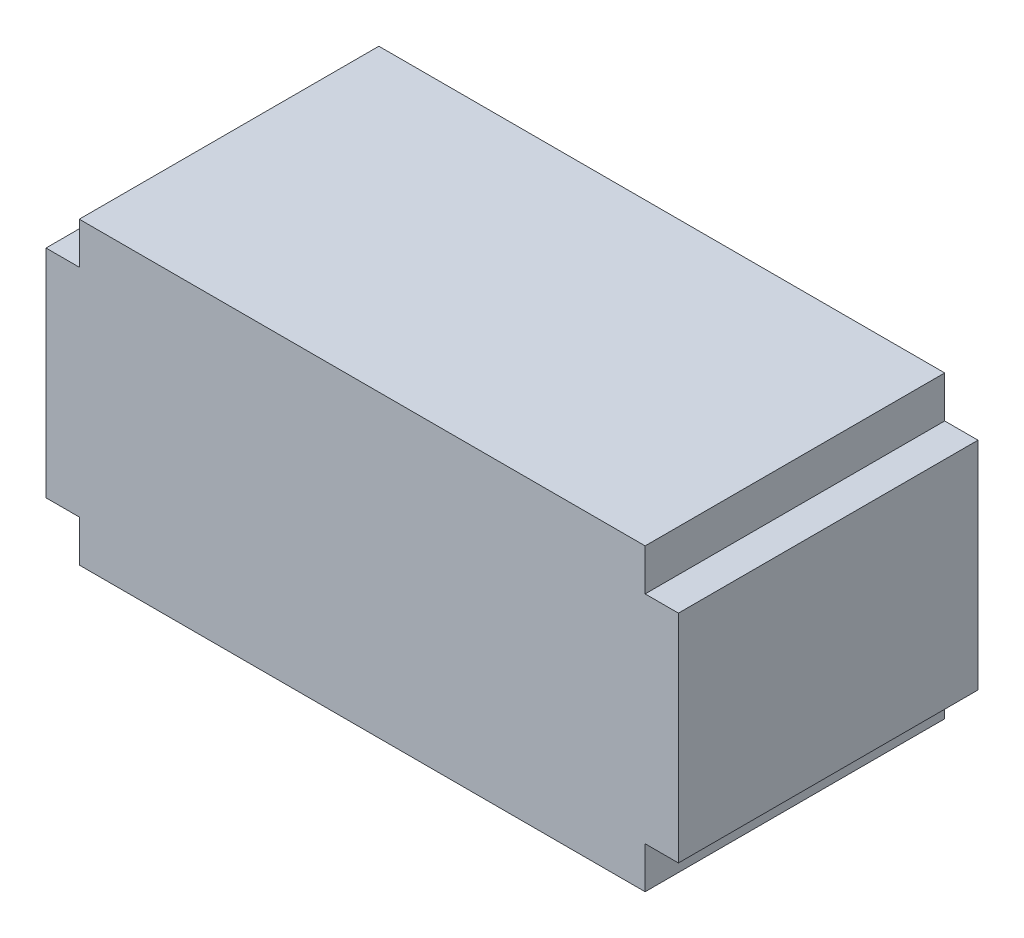
ISO-10303-21;
HEADER;
FILE_DESCRIPTION(('STEP AP214'),'2;1');
FILE_NAME('part.step','',(''),(''),'','','');
FILE_SCHEMA(('AUTOMOTIVE_DESIGN { 1 0 10303 214 1 1 1 1 }'));
ENDSEC;
DATA;
#1=APPLICATION_CONTEXT('core data for automotive mechanical design processes');
#2=APPLICATION_PROTOCOL_DEFINITION('international standard','automotive_design',2000,#1);
#3=PRODUCT_CONTEXT('',#1,'mechanical');
#4=PRODUCT('Part','Part','',(#3));
#5=PRODUCT_RELATED_PRODUCT_CATEGORY('part','',(#4));
#6=PRODUCT_DEFINITION_FORMATION('','',#4);
#7=PRODUCT_DEFINITION_CONTEXT('part definition',#1,'design');
#8=PRODUCT_DEFINITION('design','',#6,#7);
#9=PRODUCT_DEFINITION_SHAPE('','',#8);
#10=(LENGTH_UNIT() NAMED_UNIT(*) SI_UNIT(.MILLI.,.METRE.));
#11=(NAMED_UNIT(*) PLANE_ANGLE_UNIT() SI_UNIT($,.RADIAN.));
#12=(NAMED_UNIT(*) SI_UNIT($,.STERADIAN.) SOLID_ANGLE_UNIT());
#13=UNCERTAINTY_MEASURE_WITH_UNIT(LENGTH_MEASURE(1.E-05),#10,'distance_accuracy_value','');
#14=(GEOMETRIC_REPRESENTATION_CONTEXT(3) GLOBAL_UNCERTAINTY_ASSIGNED_CONTEXT((#13)) GLOBAL_UNIT_ASSIGNED_CONTEXT((#10,
#11,#12)) REPRESENTATION_CONTEXT('',''));
#15=CARTESIAN_POINT('',(0.,0.,0.));
#16=DIRECTION('',(0.,0.,1.));
#17=DIRECTION('',(1.,0.,0.));
#18=AXIS2_PLACEMENT_3D('',#15,#16,#17);
#19=CARTESIAN_POINT('',(1.7,-0.9,1.8));
#20=DIRECTION('',(0.,1.,0.));
#21=DIRECTION('',(0.,0.,1.));
#22=AXIS2_PLACEMENT_3D('',#19,#20,#21);
#23=PLANE('',#22);
#24=DIRECTION('',(1.,0.,0.));
#25=VECTOR('',#24,1.);
#26=CARTESIAN_POINT('',(1.7,-0.9,0.));
#27=LINE('',#26,#25);
#28=CARTESIAN_POINT('',(-1.7,-0.9,0.));
#29=VERTEX_POINT('',#28);
#30=CARTESIAN_POINT('',(1.7,-0.9,0.));
#31=VERTEX_POINT('',#30);
#32=EDGE_CURVE('E154',#29,#31,#27,.T.);
#33=ORIENTED_EDGE('',*,*,#32,.T.);
#34=DIRECTION('',(0.,0.,-1.));
#35=VECTOR('',#34,1.);
#36=CARTESIAN_POINT('',(1.7,-0.9,1.8));
#37=LINE('',#36,#35);
#38=CARTESIAN_POINT('',(1.7,-0.9,1.8));
#39=VERTEX_POINT('',#38);
#40=EDGE_CURVE('E11',#39,#31,#37,.T.);
#41=ORIENTED_EDGE('',*,*,#40,.F.);
#42=DIRECTION('',(1.,0.,0.));
#43=VECTOR('',#42,1.);
#44=CARTESIAN_POINT('',(1.7,-0.9,1.8));
#45=LINE('',#44,#43);
#46=CARTESIAN_POINT('',(-1.7,-0.9,1.8));
#47=VERTEX_POINT('',#46);
#48=EDGE_CURVE('E176',#47,#39,#45,.T.);
#49=ORIENTED_EDGE('',*,*,#48,.F.);
#50=DIRECTION('',(0.,0.,-1.));
#51=VECTOR('',#50,1.);
#52=CARTESIAN_POINT('',(-1.7,-0.9,1.8));
#53=LINE('',#52,#51);
#54=EDGE_CURVE('E150',#47,#29,#53,.T.);
#55=ORIENTED_EDGE('',*,*,#54,.T.);
#56=EDGE_LOOP('',(#33,#41,#49,#55));
#57=FACE_BOUND('',#56,.T.);
#58=ADVANCED_FACE('F34',(#57),#23,.F.);
#59=CARTESIAN_POINT('',(1.7,-0.65,1.8));
#60=DIRECTION('',(-1.,0.,0.));
#61=DIRECTION('',(0.,0.,1.));
#62=AXIS2_PLACEMENT_3D('',#59,#60,#61);
#63=PLANE('',#62);
#64=DIRECTION('',(0.,1.,0.));
#65=VECTOR('',#64,1.);
#66=CARTESIAN_POINT('',(1.7,-0.65,0.));
#67=LINE('',#66,#65);
#68=CARTESIAN_POINT('',(1.7,-0.65,0.));
#69=VERTEX_POINT('',#68);
#70=EDGE_CURVE('E157',#31,#69,#67,.T.);
#71=ORIENTED_EDGE('',*,*,#70,.T.);
#72=DIRECTION('',(0.,0.,-1.));
#73=VECTOR('',#72,1.);
#74=CARTESIAN_POINT('',(1.7,-0.65,1.8));
#75=LINE('',#74,#73);
#76=CARTESIAN_POINT('',(1.7,-0.65,1.8));
#77=VERTEX_POINT('',#76);
#78=EDGE_CURVE('E42',#77,#69,#75,.T.);
#79=ORIENTED_EDGE('',*,*,#78,.F.);
#80=DIRECTION('',(0.,1.,0.));
#81=VECTOR('',#80,1.);
#82=CARTESIAN_POINT('',(1.7,-0.65,1.8));
#83=LINE('',#82,#81);
#84=EDGE_CURVE('E105',#39,#77,#83,.T.);
#85=ORIENTED_EDGE('',*,*,#84,.F.);
#86=ORIENTED_EDGE('',*,*,#40,.T.);
#87=EDGE_LOOP('',(#71,#79,#85,#86));
#88=FACE_BOUND('',#87,.T.);
#89=ADVANCED_FACE('F254',(#88),#63,.F.);
#90=CARTESIAN_POINT('',(1.9,-0.65,1.8));
#91=DIRECTION('',(0.,1.,0.));
#92=DIRECTION('',(0.,0.,1.));
#93=AXIS2_PLACEMENT_3D('',#90,#91,#92);
#94=PLANE('',#93);
#95=DIRECTION('',(1.,0.,0.));
#96=VECTOR('',#95,1.);
#97=CARTESIAN_POINT('',(1.9,-0.65,0.));
#98=LINE('',#97,#96);
#99=CARTESIAN_POINT('',(1.9,-0.65,0.));
#100=VERTEX_POINT('',#99);
#101=EDGE_CURVE('E159',#69,#100,#98,.T.);
#102=ORIENTED_EDGE('',*,*,#101,.T.);
#103=DIRECTION('',(0.,0.,-1.));
#104=VECTOR('',#103,1.);
#105=CARTESIAN_POINT('',(1.9,-0.65,1.8));
#106=LINE('',#105,#104);
#107=CARTESIAN_POINT('',(1.9,-0.65,1.8));
#108=VERTEX_POINT('',#107);
#109=EDGE_CURVE('E195',#108,#100,#106,.T.);
#110=ORIENTED_EDGE('',*,*,#109,.F.);
#111=DIRECTION('',(1.,0.,0.));
#112=VECTOR('',#111,1.);
#113=CARTESIAN_POINT('',(1.9,-0.65,1.8));
#114=LINE('',#113,#112);
#115=EDGE_CURVE('E203',#77,#108,#114,.T.);
#116=ORIENTED_EDGE('',*,*,#115,.F.);
#117=ORIENTED_EDGE('',*,*,#78,.T.);
#118=EDGE_LOOP('',(#102,#110,#116,#117));
#119=FACE_BOUND('',#118,.T.);
#120=ADVANCED_FACE('F201',(#119),#94,.F.);
#121=CARTESIAN_POINT('',(1.9,0.65,1.8));
#122=DIRECTION('',(-1.,0.,0.));
#123=DIRECTION('',(0.,0.,1.));
#124=AXIS2_PLACEMENT_3D('',#121,#122,#123);
#125=PLANE('',#124);
#126=DIRECTION('',(0.,1.,0.));
#127=VECTOR('',#126,1.);
#128=CARTESIAN_POINT('',(1.9,0.65,0.));
#129=LINE('',#128,#127);
#130=CARTESIAN_POINT('',(1.9,0.65,0.));
#131=VERTEX_POINT('',#130);
#132=EDGE_CURVE('E161',#100,#131,#129,.T.);
#133=ORIENTED_EDGE('',*,*,#132,.T.);
#134=DIRECTION('',(0.,0.,-1.));
#135=VECTOR('',#134,1.);
#136=CARTESIAN_POINT('',(1.9,0.65,1.8));
#137=LINE('',#136,#135);
#138=CARTESIAN_POINT('',(1.9,0.65,1.8));
#139=VERTEX_POINT('',#138);
#140=EDGE_CURVE('E192',#139,#131,#137,.T.);
#141=ORIENTED_EDGE('',*,*,#140,.F.);
#142=DIRECTION('',(0.,1.,0.));
#143=VECTOR('',#142,1.);
#144=CARTESIAN_POINT('',(1.9,0.65,1.8));
#145=LINE('',#144,#143);
#146=EDGE_CURVE('E221',#108,#139,#145,.T.);
#147=ORIENTED_EDGE('',*,*,#146,.F.);
#148=ORIENTED_EDGE('',*,*,#109,.T.);
#149=EDGE_LOOP('',(#133,#141,#147,#148));
#150=FACE_BOUND('',#149,.T.);
#151=ADVANCED_FACE('F212',(#150),#125,.F.);
#152=CARTESIAN_POINT('',(1.7,0.65,1.8));
#153=DIRECTION('',(0.,-1.,0.));
#154=DIRECTION('',(0.,0.,-1.));
#155=AXIS2_PLACEMENT_3D('',#152,#153,#154);
#156=PLANE('',#155);
#157=DIRECTION('',(-1.,0.,0.));
#158=VECTOR('',#157,1.);
#159=CARTESIAN_POINT('',(1.7,0.65,0.));
#160=LINE('',#159,#158);
#161=CARTESIAN_POINT('',(1.7,0.65,0.));
#162=VERTEX_POINT('',#161);
#163=EDGE_CURVE('E163',#131,#162,#160,.T.);
#164=ORIENTED_EDGE('',*,*,#163,.T.);
#165=DIRECTION('',(0.,0.,-1.));
#166=VECTOR('',#165,1.);
#167=CARTESIAN_POINT('',(1.7,0.65,1.8));
#168=LINE('',#167,#166);
#169=CARTESIAN_POINT('',(1.7,0.65,1.8));
#170=VERTEX_POINT('',#169);
#171=EDGE_CURVE('E189',#170,#162,#168,.T.);
#172=ORIENTED_EDGE('',*,*,#171,.F.);
#173=DIRECTION('',(-1.,0.,0.));
#174=VECTOR('',#173,1.);
#175=CARTESIAN_POINT('',(1.7,0.65,1.8));
#176=LINE('',#175,#174);
#177=EDGE_CURVE('E218',#139,#170,#176,.T.);
#178=ORIENTED_EDGE('',*,*,#177,.F.);
#179=ORIENTED_EDGE('',*,*,#140,.T.);
#180=EDGE_LOOP('',(#164,#172,#178,#179));
#181=FACE_BOUND('',#180,.T.);
#182=ADVANCED_FACE('F216',(#181),#156,.F.);
#183=CARTESIAN_POINT('',(1.7,0.9,1.8));
#184=DIRECTION('',(-1.,0.,0.));
#185=DIRECTION('',(0.,0.,1.));
#186=AXIS2_PLACEMENT_3D('',#183,#184,#185);
#187=PLANE('',#186);
#188=DIRECTION('',(0.,1.,0.));
#189=VECTOR('',#188,1.);
#190=CARTESIAN_POINT('',(1.7,0.9,0.));
#191=LINE('',#190,#189);
#192=CARTESIAN_POINT('',(1.7,0.9,0.));
#193=VERTEX_POINT('',#192);
#194=EDGE_CURVE('E165',#162,#193,#191,.T.);
#195=ORIENTED_EDGE('',*,*,#194,.T.);
#196=DIRECTION('',(0.,0.,-1.));
#197=VECTOR('',#196,1.);
#198=CARTESIAN_POINT('',(1.7,0.9,1.8));
#199=LINE('',#198,#197);
#200=CARTESIAN_POINT('',(1.7,0.9,1.8));
#201=VERTEX_POINT('',#200);
#202=EDGE_CURVE('E186',#201,#193,#199,.T.);
#203=ORIENTED_EDGE('',*,*,#202,.F.);
#204=DIRECTION('',(0.,1.,0.));
#205=VECTOR('',#204,1.);
#206=CARTESIAN_POINT('',(1.7,0.9,1.8));
#207=LINE('',#206,#205);
#208=EDGE_CURVE('E220',#170,#201,#207,.T.);
#209=ORIENTED_EDGE('',*,*,#208,.F.);
#210=ORIENTED_EDGE('',*,*,#171,.T.);
#211=EDGE_LOOP('',(#195,#203,#209,#210));
#212=FACE_BOUND('',#211,.T.);
#213=ADVANCED_FACE('F267',(#212),#187,.F.);
#214=CARTESIAN_POINT('',(-1.7,0.9,1.8));
#215=DIRECTION('',(0.,-1.,0.));
#216=DIRECTION('',(0.,0.,-1.));
#217=AXIS2_PLACEMENT_3D('',#214,#215,#216);
#218=PLANE('',#217);
#219=DIRECTION('',(-1.,0.,0.));
#220=VECTOR('',#219,1.);
#221=CARTESIAN_POINT('',(-1.7,0.9,0.));
#222=LINE('',#221,#220);
#223=CARTESIAN_POINT('',(-1.7,0.9,0.));
#224=VERTEX_POINT('',#223);
#225=EDGE_CURVE('E167',#193,#224,#222,.T.);
#226=ORIENTED_EDGE('',*,*,#225,.T.);
#227=DIRECTION('',(0.,0.,-1.));
#228=VECTOR('',#227,1.);
#229=CARTESIAN_POINT('',(-1.7,0.9,1.8));
#230=LINE('',#229,#228);
#231=CARTESIAN_POINT('',(-1.7,0.9,1.8));
#232=VERTEX_POINT('',#231);
#233=EDGE_CURVE('E183',#232,#224,#230,.T.);
#234=ORIENTED_EDGE('',*,*,#233,.F.);
#235=DIRECTION('',(-1.,0.,0.));
#236=VECTOR('',#235,1.);
#237=CARTESIAN_POINT('',(-1.7,0.9,1.8));
#238=LINE('',#237,#236);
#239=EDGE_CURVE('E223',#201,#232,#238,.T.);
#240=ORIENTED_EDGE('',*,*,#239,.F.);
#241=ORIENTED_EDGE('',*,*,#202,.T.);
#242=EDGE_LOOP('',(#226,#234,#240,#241));
#243=FACE_BOUND('',#242,.T.);
#244=ADVANCED_FACE('F270',(#243),#218,.F.);
#245=CARTESIAN_POINT('',(-1.7,0.65,1.8));
#246=DIRECTION('',(1.,0.,0.));
#247=DIRECTION('',(0.,0.,-1.));
#248=AXIS2_PLACEMENT_3D('',#245,#246,#247);
#249=PLANE('',#248);
#250=DIRECTION('',(0.,-1.,0.));
#251=VECTOR('',#250,1.);
#252=CARTESIAN_POINT('',(-1.7,0.65,0.));
#253=LINE('',#252,#251);
#254=CARTESIAN_POINT('',(-1.7,0.65,0.));
#255=VERTEX_POINT('',#254);
#256=EDGE_CURVE('E169',#224,#255,#253,.T.);
#257=ORIENTED_EDGE('',*,*,#256,.T.);
#258=DIRECTION('',(0.,0.,-1.));
#259=VECTOR('',#258,1.);
#260=CARTESIAN_POINT('',(-1.7,0.65,1.8));
#261=LINE('',#260,#259);
#262=CARTESIAN_POINT('',(-1.7,0.65,1.8));
#263=VERTEX_POINT('',#262);
#264=EDGE_CURVE('E180',#263,#255,#261,.T.);
#265=ORIENTED_EDGE('',*,*,#264,.F.);
#266=DIRECTION('',(0.,-1.,0.));
#267=VECTOR('',#266,1.);
#268=CARTESIAN_POINT('',(-1.7,0.65,1.8));
#269=LINE('',#268,#267);
#270=EDGE_CURVE('E229',#232,#263,#269,.T.);
#271=ORIENTED_EDGE('',*,*,#270,.F.);
#272=ORIENTED_EDGE('',*,*,#233,.T.);
#273=EDGE_LOOP('',(#257,#265,#271,#272));
#274=FACE_BOUND('',#273,.T.);
#275=ADVANCED_FACE('F235',(#274),#249,.F.);
#276=CARTESIAN_POINT('',(-1.9,0.65,1.8));
#277=DIRECTION('',(0.,-1.,0.));
#278=DIRECTION('',(0.,0.,-1.));
#279=AXIS2_PLACEMENT_3D('',#276,#277,#278);
#280=PLANE('',#279);
#281=DIRECTION('',(-1.,0.,0.));
#282=VECTOR('',#281,1.);
#283=CARTESIAN_POINT('',(-1.9,0.65,0.));
#284=LINE('',#283,#282);
#285=CARTESIAN_POINT('',(-1.9,0.65,0.));
#286=VERTEX_POINT('',#285);
#287=EDGE_CURVE('E171',#255,#286,#284,.T.);
#288=ORIENTED_EDGE('',*,*,#287,.T.);
#289=DIRECTION('',(0.,0.,-1.));
#290=VECTOR('',#289,1.);
#291=CARTESIAN_POINT('',(-1.9,0.65,1.8));
#292=LINE('',#291,#290);
#293=CARTESIAN_POINT('',(-1.9,0.65,1.8));
#294=VERTEX_POINT('',#293);
#295=EDGE_CURVE('E145',#294,#286,#292,.T.);
#296=ORIENTED_EDGE('',*,*,#295,.F.);
#297=DIRECTION('',(-1.,0.,0.));
#298=VECTOR('',#297,1.);
#299=CARTESIAN_POINT('',(-1.9,0.65,1.8));
#300=LINE('',#299,#298);
#301=EDGE_CURVE('E136',#263,#294,#300,.T.);
#302=ORIENTED_EDGE('',*,*,#301,.F.);
#303=ORIENTED_EDGE('',*,*,#264,.T.);
#304=EDGE_LOOP('',(#288,#296,#302,#303));
#305=FACE_BOUND('',#304,.T.);
#306=ADVANCED_FACE('F239',(#305),#280,.F.);
#307=CARTESIAN_POINT('',(-1.9,-0.65,1.8));
#308=DIRECTION('',(1.,0.,0.));
#309=DIRECTION('',(0.,0.,-1.));
#310=AXIS2_PLACEMENT_3D('',#307,#308,#309);
#311=PLANE('',#310);
#312=DIRECTION('',(0.,-1.,0.));
#313=VECTOR('',#312,1.);
#314=CARTESIAN_POINT('',(-1.9,-0.65,0.));
#315=LINE('',#314,#313);
#316=CARTESIAN_POINT('',(-1.9,-0.65,0.));
#317=VERTEX_POINT('',#316);
#318=EDGE_CURVE('E144',#286,#317,#315,.T.);
#319=ORIENTED_EDGE('',*,*,#318,.T.);
#320=DIRECTION('',(0.,0.,-1.));
#321=VECTOR('',#320,1.);
#322=CARTESIAN_POINT('',(-1.9,-0.65,1.8));
#323=LINE('',#322,#321);
#324=CARTESIAN_POINT('',(-1.9,-0.65,1.8));
#325=VERTEX_POINT('',#324);
#326=EDGE_CURVE('E141',#325,#317,#323,.T.);
#327=ORIENTED_EDGE('',*,*,#326,.F.);
#328=DIRECTION('',(0.,-1.,0.));
#329=VECTOR('',#328,1.);
#330=CARTESIAN_POINT('',(-1.9,-0.65,1.8));
#331=LINE('',#330,#329);
#332=EDGE_CURVE('E130',#294,#325,#331,.T.);
#333=ORIENTED_EDGE('',*,*,#332,.F.);
#334=ORIENTED_EDGE('',*,*,#295,.T.);
#335=EDGE_LOOP('',(#319,#327,#333,#334));
#336=FACE_BOUND('',#335,.T.);
#337=ADVANCED_FACE('F142',(#336),#311,.F.);
#338=CARTESIAN_POINT('',(-1.7,-0.65,1.8));
#339=DIRECTION('',(0.,1.,0.));
#340=DIRECTION('',(0.,0.,1.));
#341=AXIS2_PLACEMENT_3D('',#338,#339,#340);
#342=PLANE('',#341);
#343=DIRECTION('',(1.,0.,0.));
#344=VECTOR('',#343,1.);
#345=CARTESIAN_POINT('',(-1.7,-0.65,0.));
#346=LINE('',#345,#344);
#347=CARTESIAN_POINT('',(-1.7,-0.65,0.));
#348=VERTEX_POINT('',#347);
#349=EDGE_CURVE('E91',#317,#348,#346,.T.);
#350=ORIENTED_EDGE('',*,*,#349,.T.);
#351=DIRECTION('',(0.,0.,-1.));
#352=VECTOR('',#351,1.);
#353=CARTESIAN_POINT('',(-1.7,-0.65,1.8));
#354=LINE('',#353,#352);
#355=CARTESIAN_POINT('',(-1.7,-0.65,1.8));
#356=VERTEX_POINT('',#355);
#357=EDGE_CURVE('E146',#356,#348,#354,.T.);
#358=ORIENTED_EDGE('',*,*,#357,.F.);
#359=DIRECTION('',(1.,0.,0.));
#360=VECTOR('',#359,1.);
#361=CARTESIAN_POINT('',(-1.7,-0.65,1.8));
#362=LINE('',#361,#360);
#363=EDGE_CURVE('E134',#325,#356,#362,.T.);
#364=ORIENTED_EDGE('',*,*,#363,.F.);
#365=ORIENTED_EDGE('',*,*,#326,.T.);
#366=EDGE_LOOP('',(#350,#358,#364,#365));
#367=FACE_BOUND('',#366,.T.);
#368=ADVANCED_FACE('F148',(#367),#342,.F.);
#369=CARTESIAN_POINT('',(-1.7,-0.9,1.8));
#370=DIRECTION('',(1.,0.,0.));
#371=DIRECTION('',(0.,0.,-1.));
#372=AXIS2_PLACEMENT_3D('',#369,#370,#371);
#373=PLANE('',#372);
#374=DIRECTION('',(0.,-1.,0.));
#375=VECTOR('',#374,1.);
#376=CARTESIAN_POINT('',(-1.7,-0.9,0.));
#377=LINE('',#376,#375);
#378=EDGE_CURVE('E97',#348,#29,#377,.T.);
#379=ORIENTED_EDGE('',*,*,#378,.T.);
#380=ORIENTED_EDGE('',*,*,#54,.F.);
#381=DIRECTION('',(0.,-1.,0.));
#382=VECTOR('',#381,1.);
#383=CARTESIAN_POINT('',(-1.7,-0.9,1.8));
#384=LINE('',#383,#382);
#385=EDGE_CURVE('E50',#356,#47,#384,.T.);
#386=ORIENTED_EDGE('',*,*,#385,.F.);
#387=ORIENTED_EDGE('',*,*,#357,.T.);
#388=EDGE_LOOP('',(#379,#380,#386,#387));
#389=FACE_BOUND('',#388,.T.);
#390=ADVANCED_FACE('F243',(#389),#373,.F.);
#391=CARTESIAN_POINT('',(0.,0.,1.8));
#392=DIRECTION('',(0.,0.,-1.));
#393=DIRECTION('',(-1.,0.,0.));
#394=AXIS2_PLACEMENT_3D('',#391,#392,#393);
#395=PLANE('',#394);
#396=ORIENTED_EDGE('',*,*,#48,.T.);
#397=ORIENTED_EDGE('',*,*,#84,.T.);
#398=ORIENTED_EDGE('',*,*,#115,.T.);
#399=ORIENTED_EDGE('',*,*,#146,.T.);
#400=ORIENTED_EDGE('',*,*,#177,.T.);
#401=ORIENTED_EDGE('',*,*,#208,.T.);
#402=ORIENTED_EDGE('',*,*,#239,.T.);
#403=ORIENTED_EDGE('',*,*,#270,.T.);
#404=ORIENTED_EDGE('',*,*,#301,.T.);
#405=ORIENTED_EDGE('',*,*,#332,.T.);
#406=ORIENTED_EDGE('',*,*,#363,.T.);
#407=ORIENTED_EDGE('',*,*,#385,.T.);
#408=EDGE_LOOP('',(#396,#397,#398,#399,#400,#401,#402,#403,#404,#405,#406,#407));
#409=FACE_BOUND('',#408,.T.);
#410=ADVANCED_FACE('F132',(#409),#395,.F.);
#411=CARTESIAN_POINT('',(0.,0.,0.));
#412=DIRECTION('',(0.,0.,-1.));
#413=DIRECTION('',(-1.,0.,0.));
#414=AXIS2_PLACEMENT_3D('',#411,#412,#413);
#415=PLANE('',#414);
#416=ORIENTED_EDGE('',*,*,#32,.F.);
#417=ORIENTED_EDGE('',*,*,#378,.F.);
#418=ORIENTED_EDGE('',*,*,#349,.F.);
#419=ORIENTED_EDGE('',*,*,#318,.F.);
#420=ORIENTED_EDGE('',*,*,#287,.F.);
#421=ORIENTED_EDGE('',*,*,#256,.F.);
#422=ORIENTED_EDGE('',*,*,#225,.F.);
#423=ORIENTED_EDGE('',*,*,#194,.F.);
#424=ORIENTED_EDGE('',*,*,#163,.F.);
#425=ORIENTED_EDGE('',*,*,#132,.F.);
#426=ORIENTED_EDGE('',*,*,#101,.F.);
#427=ORIENTED_EDGE('',*,*,#70,.F.);
#428=EDGE_LOOP('',(#416,#417,#418,#419,#420,#421,#422,#423,#424,#425,#426,#427));
#429=FACE_BOUND('',#428,.T.);
#430=ADVANCED_FACE('F207',(#429),#415,.T.);
#431=CLOSED_SHELL('',(#58,#89,#120,#151,#182,#213,#244,#275,#306,#337,#368,#390,#410,#430));
#432=MANIFOLD_SOLID_BREP('B2',#431);
#433=ADVANCED_BREP_SHAPE_REPRESENTATION('',(#18,#432),#14);
#434=SHAPE_DEFINITION_REPRESENTATION(#9,#433);
ENDSEC;
END-ISO-10303-21;
